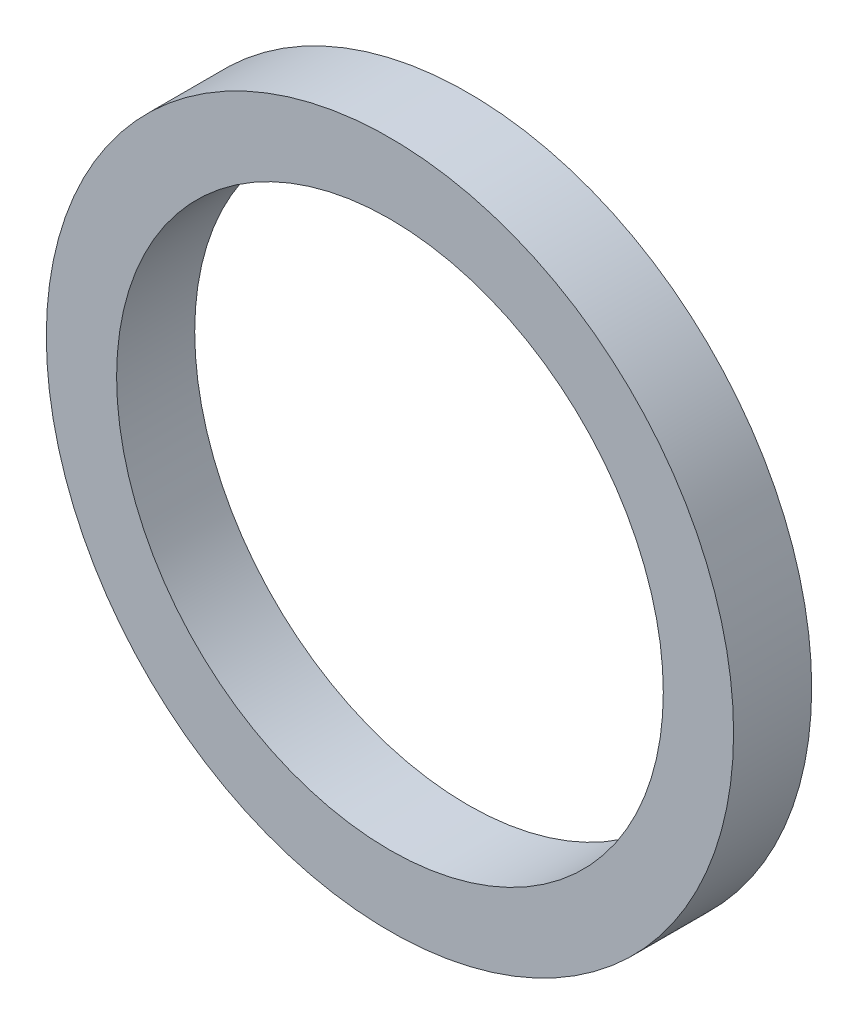
ISO-10303-21;
HEADER;
FILE_DESCRIPTION(('STEP AP214'),'2;1');
FILE_NAME('part.step','',(''),(''),'','','');
FILE_SCHEMA(('AUTOMOTIVE_DESIGN { 1 0 10303 214 1 1 1 1 }'));
ENDSEC;
DATA;
#1=APPLICATION_CONTEXT('core data for automotive mechanical design processes');
#2=APPLICATION_PROTOCOL_DEFINITION('international standard','automotive_design',2000,#1);
#3=PRODUCT_CONTEXT('',#1,'mechanical');
#4=PRODUCT('Part','Part','',(#3));
#5=PRODUCT_RELATED_PRODUCT_CATEGORY('part','',(#4));
#6=PRODUCT_DEFINITION_FORMATION('','',#4);
#7=PRODUCT_DEFINITION_CONTEXT('part definition',#1,'design');
#8=PRODUCT_DEFINITION('design','',#6,#7);
#9=PRODUCT_DEFINITION_SHAPE('','',#8);
#10=(LENGTH_UNIT() NAMED_UNIT(*) SI_UNIT(.MILLI.,.METRE.));
#11=(NAMED_UNIT(*) PLANE_ANGLE_UNIT() SI_UNIT($,.RADIAN.));
#12=(NAMED_UNIT(*) SI_UNIT($,.STERADIAN.) SOLID_ANGLE_UNIT());
#13=UNCERTAINTY_MEASURE_WITH_UNIT(LENGTH_MEASURE(1.E-05),#10,'distance_accuracy_value','');
#14=(GEOMETRIC_REPRESENTATION_CONTEXT(3) GLOBAL_UNCERTAINTY_ASSIGNED_CONTEXT((#13)) GLOBAL_UNIT_ASSIGNED_CONTEXT((#10,
#11,#12)) REPRESENTATION_CONTEXT('',''));
#15=CARTESIAN_POINT('',(0.,0.,0.));
#16=DIRECTION('',(0.,0.,1.));
#17=DIRECTION('',(1.,0.,0.));
#18=AXIS2_PLACEMENT_3D('',#15,#16,#17);
#19=CARTESIAN_POINT('',(0.,0.,5.));
#20=DIRECTION('',(0.,0.,1.));
#21=DIRECTION('',(1.,0.,0.));
#22=AXIS2_PLACEMENT_3D('',#19,#20,#21);
#23=PLANE('',#22);
#24=CARTESIAN_POINT('',(0.,0.,5.));
#25=DIRECTION('',(0.,0.,1.));
#26=DIRECTION('',(1.,0.,0.));
#27=AXIS2_PLACEMENT_3D('',#24,#25,#26);
#28=CIRCLE('',#27,22.);
#29=CARTESIAN_POINT('',(22.,0.,5.));
#30=VERTEX_POINT('',#29);
#31=EDGE_CURVE('E10',#30,#30,#28,.T.);
#32=ORIENTED_EDGE('',*,*,#31,.T.);
#33=EDGE_LOOP('',(#32));
#34=FACE_BOUND('',#33,.T.);
#35=CARTESIAN_POINT('',(0.,0.,5.));
#36=DIRECTION('',(0.,0.,1.));
#37=DIRECTION('',(1.,0.,0.));
#38=AXIS2_PLACEMENT_3D('',#35,#36,#37);
#39=CIRCLE('',#38,17.5);
#40=CARTESIAN_POINT('',(17.5,0.,5.));
#41=VERTEX_POINT('',#40);
#42=EDGE_CURVE('E50',#41,#41,#39,.T.);
#43=ORIENTED_EDGE('',*,*,#42,.F.);
#44=EDGE_LOOP('',(#43));
#45=FACE_BOUND('',#44,.T.);
#46=ADVANCED_FACE('F39',(#34,#45),#23,.T.);
#47=CARTESIAN_POINT('',(0.,0.,0.));
#48=DIRECTION('',(0.,0.,1.));
#49=DIRECTION('',(1.,0.,0.));
#50=AXIS2_PLACEMENT_3D('',#47,#48,#49);
#51=PLANE('',#50);
#52=CARTESIAN_POINT('',(0.,0.,0.));
#53=DIRECTION('',(0.,0.,1.));
#54=DIRECTION('',(1.,0.,0.));
#55=AXIS2_PLACEMENT_3D('',#52,#53,#54);
#56=CIRCLE('',#55,22.);
#57=CARTESIAN_POINT('',(22.,0.,0.));
#58=VERTEX_POINT('',#57);
#59=EDGE_CURVE('E43',#58,#58,#56,.T.);
#60=ORIENTED_EDGE('',*,*,#59,.F.);
#61=EDGE_LOOP('',(#60));
#62=FACE_BOUND('',#61,.T.);
#63=CARTESIAN_POINT('',(0.,0.,0.));
#64=DIRECTION('',(0.,0.,1.));
#65=DIRECTION('',(1.,0.,0.));
#66=AXIS2_PLACEMENT_3D('',#63,#64,#65);
#67=CIRCLE('',#66,17.5);
#68=CARTESIAN_POINT('',(17.5,0.,0.));
#69=VERTEX_POINT('',#68);
#70=EDGE_CURVE('E52',#69,#69,#67,.T.);
#71=ORIENTED_EDGE('',*,*,#70,.T.);
#72=EDGE_LOOP('',(#71));
#73=FACE_BOUND('',#72,.T.);
#74=ADVANCED_FACE('F62',(#62,#73),#51,.F.);
#75=CARTESIAN_POINT('',(0.,0.,5.));
#76=DIRECTION('',(0.,0.,-1.));
#77=DIRECTION('',(-1.,0.,0.));
#78=AXIS2_PLACEMENT_3D('',#75,#76,#77);
#79=CYLINDRICAL_SURFACE('',#78,22.);
#80=ORIENTED_EDGE('',*,*,#31,.F.);
#81=EDGE_LOOP('',(#80));
#82=FACE_BOUND('',#81,.T.);
#83=ORIENTED_EDGE('',*,*,#59,.T.);
#84=EDGE_LOOP('',(#83));
#85=FACE_BOUND('',#84,.T.);
#86=ADVANCED_FACE('F41',(#82,#85),#79,.T.);
#87=CARTESIAN_POINT('',(0.,0.,5.));
#88=DIRECTION('',(0.,0.,-1.));
#89=DIRECTION('',(-1.,0.,0.));
#90=AXIS2_PLACEMENT_3D('',#87,#88,#89);
#91=CYLINDRICAL_SURFACE('',#90,17.5);
#92=ORIENTED_EDGE('',*,*,#42,.T.);
#93=EDGE_LOOP('',(#92));
#94=FACE_BOUND('',#93,.T.);
#95=ORIENTED_EDGE('',*,*,#70,.F.);
#96=EDGE_LOOP('',(#95));
#97=FACE_BOUND('',#96,.T.);
#98=ADVANCED_FACE('F58',(#94,#97),#91,.F.);
#99=CLOSED_SHELL('',(#46,#74,#86,#98));
#100=MANIFOLD_SOLID_BREP('B2',#99);
#101=ADVANCED_BREP_SHAPE_REPRESENTATION('',(#18,#100),#14);
#102=SHAPE_DEFINITION_REPRESENTATION(#9,#101);
ENDSEC;
END-ISO-10303-21;
